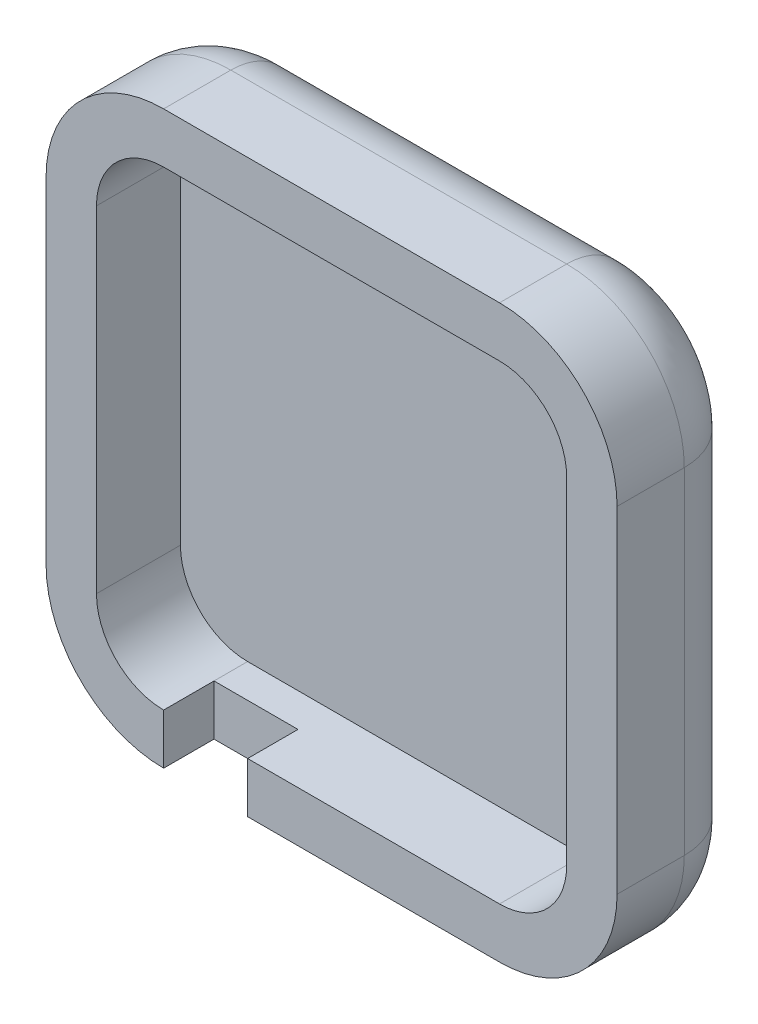
ISO-10303-21;
HEADER;
FILE_DESCRIPTION(('STEP AP214'),'2;1');
FILE_NAME('part.step','',(''),(''),'','','');
FILE_SCHEMA(('AUTOMOTIVE_DESIGN { 1 0 10303 214 1 1 1 1 }'));
ENDSEC;
DATA;
#1=APPLICATION_CONTEXT('core data for automotive mechanical design processes');
#2=APPLICATION_PROTOCOL_DEFINITION('international standard','automotive_design',2000,#1);
#3=PRODUCT_CONTEXT('',#1,'mechanical');
#4=PRODUCT('Part','Part','',(#3));
#5=PRODUCT_RELATED_PRODUCT_CATEGORY('part','',(#4));
#6=PRODUCT_DEFINITION_FORMATION('','',#4);
#7=PRODUCT_DEFINITION_CONTEXT('part definition',#1,'design');
#8=PRODUCT_DEFINITION('design','',#6,#7);
#9=PRODUCT_DEFINITION_SHAPE('','',#8);
#10=(LENGTH_UNIT() NAMED_UNIT(*) SI_UNIT(.MILLI.,.METRE.));
#11=(NAMED_UNIT(*) PLANE_ANGLE_UNIT() SI_UNIT($,.RADIAN.));
#12=(NAMED_UNIT(*) SI_UNIT($,.STERADIAN.) SOLID_ANGLE_UNIT());
#13=UNCERTAINTY_MEASURE_WITH_UNIT(LENGTH_MEASURE(1.E-05),#10,'distance_accuracy_value','');
#14=(GEOMETRIC_REPRESENTATION_CONTEXT(3) GLOBAL_UNCERTAINTY_ASSIGNED_CONTEXT((#13)) GLOBAL_UNIT_ASSIGNED_CONTEXT((#10,
#11,#12)) REPRESENTATION_CONTEXT('',''));
#15=CARTESIAN_POINT('',(0.,0.,0.));
#16=DIRECTION('',(0.,0.,1.));
#17=DIRECTION('',(1.,0.,0.));
#18=AXIS2_PLACEMENT_3D('',#15,#16,#17);
#19=CARTESIAN_POINT('',(0.,0.,4.));
#20=DIRECTION('',(1.,0.,0.));
#21=DIRECTION('',(0.,0.,-1.));
#22=AXIS2_PLACEMENT_3D('',#19,#20,#21);
#23=PLANE('',#22);
#24=DIRECTION('',(0.,0.,-1.));
#25=VECTOR('',#24,1.);
#26=CARTESIAN_POINT('',(0.,13.5,4.));
#27=LINE('',#26,#25);
#28=CARTESIAN_POINT('',(0.,13.5,4.));
#29=VERTEX_POINT('',#28);
#30=CARTESIAN_POINT('',(0.,13.5,2.));
#31=VERTEX_POINT('',#30);
#32=EDGE_CURVE('E242',#29,#31,#27,.T.);
#33=ORIENTED_EDGE('',*,*,#32,.T.);
#34=DIRECTION('',(0.,-1.,0.));
#35=VECTOR('',#34,1.);
#36=CARTESIAN_POINT('',(0.,3.5,2.));
#37=LINE('',#36,#35);
#38=CARTESIAN_POINT('',(0.,3.5,2.));
#39=VERTEX_POINT('',#38);
#40=EDGE_CURVE('E274',#31,#39,#37,.T.);
#41=ORIENTED_EDGE('',*,*,#40,.T.);
#42=DIRECTION('',(0.,0.,-1.));
#43=VECTOR('',#42,1.);
#44=CARTESIAN_POINT('',(0.,3.5,4.));
#45=LINE('',#44,#43);
#46=CARTESIAN_POINT('',(0.,3.5,4.));
#47=VERTEX_POINT('',#46);
#48=EDGE_CURVE('E245',#39,#47,#45,.F.);
#49=ORIENTED_EDGE('',*,*,#48,.T.);
#50=DIRECTION('',(0.,-1.,0.));
#51=VECTOR('',#50,1.);
#52=CARTESIAN_POINT('',(0.,0.,4.));
#53=LINE('',#52,#51);
#54=EDGE_CURVE('E332',#29,#47,#53,.T.);
#55=ORIENTED_EDGE('',*,*,#54,.F.);
#56=EDGE_LOOP('',(#33,#41,#49,#55));
#57=FACE_BOUND('',#56,.T.);
#58=ADVANCED_FACE('F35',(#57),#23,.F.);
#59=CARTESIAN_POINT('',(0.,0.,4.));
#60=DIRECTION('',(0.,1.,0.));
#61=DIRECTION('',(0.,0.,1.));
#62=AXIS2_PLACEMENT_3D('',#59,#60,#61);
#63=PLANE('',#62);
#64=DIRECTION('',(0.,0.,-1.));
#65=VECTOR('',#64,1.);
#66=CARTESIAN_POINT('',(3.5,0.,4.));
#67=LINE('',#66,#65);
#68=CARTESIAN_POINT('',(3.50000000000002,0.,2.5));
#69=VERTEX_POINT('',#68);
#70=CARTESIAN_POINT('',(3.5,0.,2.));
#71=VERTEX_POINT('',#70);
#72=EDGE_CURVE('E202',#69,#71,#67,.T.);
#73=ORIENTED_EDGE('',*,*,#72,.T.);
#74=DIRECTION('',(1.,0.,0.));
#75=VECTOR('',#74,1.);
#76=CARTESIAN_POINT('',(13.5,0.,2.));
#77=LINE('',#76,#75);
#78=CARTESIAN_POINT('',(13.5,0.,2.));
#79=VERTEX_POINT('',#78);
#80=EDGE_CURVE('E271',#71,#79,#77,.T.);
#81=ORIENTED_EDGE('',*,*,#80,.T.);
#82=DIRECTION('',(0.,0.,-1.));
#83=VECTOR('',#82,1.);
#84=CARTESIAN_POINT('',(13.5,0.,4.));
#85=LINE('',#84,#83);
#86=CARTESIAN_POINT('',(13.5,0.,4.));
#87=VERTEX_POINT('',#86);
#88=EDGE_CURVE('E201',#79,#87,#85,.F.);
#89=ORIENTED_EDGE('',*,*,#88,.T.);
#90=DIRECTION('',(1.,0.,0.));
#91=VECTOR('',#90,1.);
#92=CARTESIAN_POINT('',(0.,0.,4.));
#93=LINE('',#92,#91);
#94=CARTESIAN_POINT('',(6.,0.,4.));
#95=VERTEX_POINT('',#94);
#96=EDGE_CURVE('E344',#95,#87,#93,.T.);
#97=ORIENTED_EDGE('',*,*,#96,.F.);
#98=DIRECTION('',(0.,0.,1.));
#99=VECTOR('',#98,1.);
#100=CARTESIAN_POINT('',(6.,0.,2.5));
#101=LINE('',#100,#99);
#102=CARTESIAN_POINT('',(6.,0.,2.5));
#103=VERTEX_POINT('',#102);
#104=EDGE_CURVE('E221',#103,#95,#101,.T.);
#105=ORIENTED_EDGE('',*,*,#104,.F.);
#106=DIRECTION('',(1.,0.,0.));
#107=VECTOR('',#106,1.);
#108=CARTESIAN_POINT('',(3.50000000000002,0.,2.5));
#109=LINE('',#108,#107);
#110=EDGE_CURVE('E209',#69,#103,#109,.T.);
#111=ORIENTED_EDGE('',*,*,#110,.F.);
#112=EDGE_LOOP('',(#73,#81,#89,#97,#105,#111));
#113=FACE_BOUND('',#112,.T.);
#114=ADVANCED_FACE('F218',(#113),#63,.F.);
#115=CARTESIAN_POINT('',(17.,0.,4.));
#116=DIRECTION('',(-1.,0.,0.));
#117=DIRECTION('',(0.,0.,1.));
#118=AXIS2_PLACEMENT_3D('',#115,#116,#117);
#119=PLANE('',#118);
#120=DIRECTION('',(0.,0.,-1.));
#121=VECTOR('',#120,1.);
#122=CARTESIAN_POINT('',(17.,3.5,4.));
#123=LINE('',#122,#121);
#124=CARTESIAN_POINT('',(17.,3.5,4.));
#125=VERTEX_POINT('',#124);
#126=CARTESIAN_POINT('',(17.,3.5,2.));
#127=VERTEX_POINT('',#126);
#128=EDGE_CURVE('E228',#125,#127,#123,.T.);
#129=ORIENTED_EDGE('',*,*,#128,.T.);
#130=DIRECTION('',(0.,1.,0.));
#131=VECTOR('',#130,1.);
#132=CARTESIAN_POINT('',(17.,13.5,2.));
#133=LINE('',#132,#131);
#134=CARTESIAN_POINT('',(17.,13.5,2.));
#135=VERTEX_POINT('',#134);
#136=EDGE_CURVE('E11',#127,#135,#133,.T.);
#137=ORIENTED_EDGE('',*,*,#136,.T.);
#138=DIRECTION('',(0.,0.,-1.));
#139=VECTOR('',#138,1.);
#140=CARTESIAN_POINT('',(17.,13.5,4.));
#141=LINE('',#140,#139);
#142=CARTESIAN_POINT('',(17.,13.5,4.));
#143=VERTEX_POINT('',#142);
#144=EDGE_CURVE('E229',#135,#143,#141,.F.);
#145=ORIENTED_EDGE('',*,*,#144,.T.);
#146=DIRECTION('',(0.,1.,0.));
#147=VECTOR('',#146,1.);
#148=CARTESIAN_POINT('',(17.,0.,4.));
#149=LINE('',#148,#147);
#150=EDGE_CURVE('E347',#125,#143,#149,.T.);
#151=ORIENTED_EDGE('',*,*,#150,.F.);
#152=EDGE_LOOP('',(#129,#137,#145,#151));
#153=FACE_BOUND('',#152,.T.);
#154=ADVANCED_FACE('F390',(#153),#119,.F.);
#155=CARTESIAN_POINT('',(0.,17.,4.));
#156=DIRECTION('',(0.,-1.,0.));
#157=DIRECTION('',(0.,0.,-1.));
#158=AXIS2_PLACEMENT_3D('',#155,#156,#157);
#159=PLANE('',#158);
#160=DIRECTION('',(0.,0.,-1.));
#161=VECTOR('',#160,1.);
#162=CARTESIAN_POINT('',(13.5,17.,4.));
#163=LINE('',#162,#161);
#164=CARTESIAN_POINT('',(13.5,17.,4.));
#165=VERTEX_POINT('',#164);
#166=CARTESIAN_POINT('',(13.5,17.,2.));
#167=VERTEX_POINT('',#166);
#168=EDGE_CURVE('E249',#165,#167,#163,.T.);
#169=ORIENTED_EDGE('',*,*,#168,.T.);
#170=DIRECTION('',(-1.,0.,0.));
#171=VECTOR('',#170,1.);
#172=CARTESIAN_POINT('',(3.5,17.,2.));
#173=LINE('',#172,#171);
#174=CARTESIAN_POINT('',(3.5,17.,2.));
#175=VERTEX_POINT('',#174);
#176=EDGE_CURVE('E278',#167,#175,#173,.T.);
#177=ORIENTED_EDGE('',*,*,#176,.T.);
#178=DIRECTION('',(0.,0.,-1.));
#179=VECTOR('',#178,1.);
#180=CARTESIAN_POINT('',(3.5,17.,4.));
#181=LINE('',#180,#179);
#182=CARTESIAN_POINT('',(3.5,17.,4.));
#183=VERTEX_POINT('',#182);
#184=EDGE_CURVE('E247',#175,#183,#181,.F.);
#185=ORIENTED_EDGE('',*,*,#184,.T.);
#186=DIRECTION('',(-1.,0.,0.));
#187=VECTOR('',#186,1.);
#188=CARTESIAN_POINT('',(0.,17.,4.));
#189=LINE('',#188,#187);
#190=EDGE_CURVE('E350',#165,#183,#189,.T.);
#191=ORIENTED_EDGE('',*,*,#190,.F.);
#192=EDGE_LOOP('',(#169,#177,#185,#191));
#193=FACE_BOUND('',#192,.T.);
#194=ADVANCED_FACE('F399',(#193),#159,.F.);
#195=CARTESIAN_POINT('',(0.,0.,4.));
#196=DIRECTION('',(0.,0.,-1.));
#197=DIRECTION('',(-1.,0.,0.));
#198=AXIS2_PLACEMENT_3D('',#195,#196,#197);
#199=PLANE('',#198);
#200=CARTESIAN_POINT('',(3.5,3.5,4.));
#201=DIRECTION('',(0.,0.,-1.));
#202=DIRECTION('',(-1.,0.,0.));
#203=AXIS2_PLACEMENT_3D('',#200,#201,#202);
#204=CIRCLE('',#203,3.5);
#205=CARTESIAN_POINT('',(3.5,0.,4.));
#206=VERTEX_POINT('',#205);
#207=EDGE_CURVE('E238',#47,#206,#204,.F.);
#208=ORIENTED_EDGE('',*,*,#207,.T.);
#209=DIRECTION('',(0.,-1.,0.));
#210=VECTOR('',#209,1.);
#211=CARTESIAN_POINT('',(3.50000000000002,1.5,4.));
#212=LINE('',#211,#210);
#213=CARTESIAN_POINT('',(3.50000000000002,1.5,4.));
#214=VERTEX_POINT('',#213);
#215=EDGE_CURVE('E196',#214,#206,#212,.T.);
#216=ORIENTED_EDGE('',*,*,#215,.F.);
#217=CARTESIAN_POINT('',(3.5,3.5,4.));
#218=DIRECTION('',(0.,0.,-1.));
#219=DIRECTION('',(-1.,0.,0.));
#220=AXIS2_PLACEMENT_3D('',#217,#218,#219);
#221=CIRCLE('',#220,2.);
#222=CARTESIAN_POINT('',(1.5,3.5,4.));
#223=VERTEX_POINT('',#222);
#224=EDGE_CURVE('E386',#214,#223,#221,.T.);
#225=ORIENTED_EDGE('',*,*,#224,.T.);
#226=DIRECTION('',(0.,-1.,0.));
#227=VECTOR('',#226,1.);
#228=CARTESIAN_POINT('',(1.5,15.5,4.));
#229=LINE('',#228,#227);
#230=CARTESIAN_POINT('',(1.5,13.5,4.));
#231=VERTEX_POINT('',#230);
#232=EDGE_CURVE('E314',#231,#223,#229,.T.);
#233=ORIENTED_EDGE('',*,*,#232,.F.);
#234=CARTESIAN_POINT('',(3.5,13.5,4.));
#235=DIRECTION('',(0.,0.,-1.));
#236=DIRECTION('',(-1.,0.,0.));
#237=AXIS2_PLACEMENT_3D('',#234,#235,#236);
#238=CIRCLE('',#237,2.);
#239=CARTESIAN_POINT('',(3.5,15.5,4.));
#240=VERTEX_POINT('',#239);
#241=EDGE_CURVE('E384',#231,#240,#238,.T.);
#242=ORIENTED_EDGE('',*,*,#241,.T.);
#243=DIRECTION('',(-1.,0.,0.));
#244=VECTOR('',#243,1.);
#245=CARTESIAN_POINT('',(1.5,15.5,4.));
#246=LINE('',#245,#244);
#247=CARTESIAN_POINT('',(13.5,15.5,4.));
#248=VERTEX_POINT('',#247);
#249=EDGE_CURVE('E323',#248,#240,#246,.T.);
#250=ORIENTED_EDGE('',*,*,#249,.F.);
#251=CARTESIAN_POINT('',(13.5,13.5,4.));
#252=DIRECTION('',(0.,0.,-1.));
#253=DIRECTION('',(-1.,0.,0.));
#254=AXIS2_PLACEMENT_3D('',#251,#252,#253);
#255=CIRCLE('',#254,2.);
#256=CARTESIAN_POINT('',(15.5,13.5,4.));
#257=VERTEX_POINT('',#256);
#258=EDGE_CURVE('E388',#248,#257,#255,.T.);
#259=ORIENTED_EDGE('',*,*,#258,.T.);
#260=DIRECTION('',(0.,1.,0.));
#261=VECTOR('',#260,1.);
#262=CARTESIAN_POINT('',(15.5,15.5,4.));
#263=LINE('',#262,#261);
#264=CARTESIAN_POINT('',(15.5,3.5,4.));
#265=VERTEX_POINT('',#264);
#266=EDGE_CURVE('E337',#265,#257,#263,.T.);
#267=ORIENTED_EDGE('',*,*,#266,.F.);
#268=CARTESIAN_POINT('',(13.5,3.5,4.));
#269=DIRECTION('',(0.,0.,-1.));
#270=DIRECTION('',(-1.,0.,0.));
#271=AXIS2_PLACEMENT_3D('',#268,#269,#270);
#272=CIRCLE('',#271,2.);
#273=CARTESIAN_POINT('',(13.5,1.5,4.));
#274=VERTEX_POINT('',#273);
#275=EDGE_CURVE('E381',#265,#274,#272,.T.);
#276=ORIENTED_EDGE('',*,*,#275,.T.);
#277=DIRECTION('',(1.,0.,0.));
#278=VECTOR('',#277,1.);
#279=CARTESIAN_POINT('',(1.5,1.5,4.));
#280=LINE('',#279,#278);
#281=CARTESIAN_POINT('',(6.,1.5,4.));
#282=VERTEX_POINT('',#281);
#283=EDGE_CURVE('E335',#282,#274,#280,.T.);
#284=ORIENTED_EDGE('',*,*,#283,.F.);
#285=DIRECTION('',(0.,1.,0.));
#286=VECTOR('',#285,1.);
#287=CARTESIAN_POINT('',(6.,1.5,4.));
#288=LINE('',#287,#286);
#289=EDGE_CURVE('E214',#95,#282,#288,.T.);
#290=ORIENTED_EDGE('',*,*,#289,.F.);
#291=ORIENTED_EDGE('',*,*,#96,.T.);
#292=CARTESIAN_POINT('',(13.5,3.5,4.));
#293=DIRECTION('',(0.,0.,-1.));
#294=DIRECTION('',(-1.,0.,0.));
#295=AXIS2_PLACEMENT_3D('',#292,#293,#294);
#296=CIRCLE('',#295,3.5);
#297=EDGE_CURVE('E240',#87,#125,#296,.F.);
#298=ORIENTED_EDGE('',*,*,#297,.T.);
#299=ORIENTED_EDGE('',*,*,#150,.T.);
#300=CARTESIAN_POINT('',(13.5,13.5,4.));
#301=DIRECTION('',(0.,0.,-1.));
#302=DIRECTION('',(-1.,0.,0.));
#303=AXIS2_PLACEMENT_3D('',#300,#301,#302);
#304=CIRCLE('',#303,3.5);
#305=EDGE_CURVE('E236',#143,#165,#304,.F.);
#306=ORIENTED_EDGE('',*,*,#305,.T.);
#307=ORIENTED_EDGE('',*,*,#190,.T.);
#308=CARTESIAN_POINT('',(3.5,13.5,4.));
#309=DIRECTION('',(0.,0.,-1.));
#310=DIRECTION('',(-1.,0.,0.));
#311=AXIS2_PLACEMENT_3D('',#308,#309,#310);
#312=CIRCLE('',#311,3.5);
#313=EDGE_CURVE('E234',#183,#29,#312,.F.);
#314=ORIENTED_EDGE('',*,*,#313,.T.);
#315=ORIENTED_EDGE('',*,*,#54,.T.);
#316=EDGE_LOOP('',(#208,#216,#225,#233,#242,#250,#259,#267,#276,#284,#290,#291,#298,#299,#306,
#307,#314,#315));
#317=FACE_BOUND('',#316,.T.);
#318=ADVANCED_FACE('F394',(#317),#199,.F.);
#319=CARTESIAN_POINT('',(0.,0.,0.));
#320=DIRECTION('',(0.,0.,-1.));
#321=DIRECTION('',(-1.,0.,0.));
#322=AXIS2_PLACEMENT_3D('',#319,#320,#321);
#323=PLANE('',#322);
#324=DIRECTION('',(0.,1.,0.));
#325=VECTOR('',#324,1.);
#326=CARTESIAN_POINT('',(15.,3.5,0.));
#327=LINE('',#326,#325);
#328=CARTESIAN_POINT('',(15.,13.5,0.));
#329=VERTEX_POINT('',#328);
#330=CARTESIAN_POINT('',(15.,3.5,0.));
#331=VERTEX_POINT('',#330);
#332=EDGE_CURVE('E251',#329,#331,#327,.F.);
#333=ORIENTED_EDGE('',*,*,#332,.T.);
#334=CARTESIAN_POINT('',(13.5,3.5,0.));
#335=DIRECTION('',(0.,0.,-1.));
#336=DIRECTION('',(-1.,0.,0.));
#337=AXIS2_PLACEMENT_3D('',#334,#335,#336);
#338=CIRCLE('',#337,1.5);
#339=CARTESIAN_POINT('',(13.5,2.,0.));
#340=VERTEX_POINT('',#339);
#341=EDGE_CURVE('E265',#331,#340,#338,.T.);
#342=ORIENTED_EDGE('',*,*,#341,.T.);
#343=DIRECTION('',(1.,0.,0.));
#344=VECTOR('',#343,1.);
#345=CARTESIAN_POINT('',(3.5,2.,0.));
#346=LINE('',#345,#344);
#347=CARTESIAN_POINT('',(3.5,2.,0.));
#348=VERTEX_POINT('',#347);
#349=EDGE_CURVE('E263',#340,#348,#346,.F.);
#350=ORIENTED_EDGE('',*,*,#349,.T.);
#351=CARTESIAN_POINT('',(3.5,3.5,0.));
#352=DIRECTION('',(0.,0.,-1.));
#353=DIRECTION('',(-1.,0.,0.));
#354=AXIS2_PLACEMENT_3D('',#351,#352,#353);
#355=CIRCLE('',#354,1.5);
#356=CARTESIAN_POINT('',(2.,3.5,0.));
#357=VERTEX_POINT('',#356);
#358=EDGE_CURVE('E261',#348,#357,#355,.T.);
#359=ORIENTED_EDGE('',*,*,#358,.T.);
#360=DIRECTION('',(0.,-1.,0.));
#361=VECTOR('',#360,1.);
#362=CARTESIAN_POINT('',(2.,13.5,0.));
#363=LINE('',#362,#361);
#364=CARTESIAN_POINT('',(2.,13.5,0.));
#365=VERTEX_POINT('',#364);
#366=EDGE_CURVE('E259',#357,#365,#363,.F.);
#367=ORIENTED_EDGE('',*,*,#366,.T.);
#368=CARTESIAN_POINT('',(3.5,13.5,0.));
#369=DIRECTION('',(0.,0.,-1.));
#370=DIRECTION('',(-1.,0.,0.));
#371=AXIS2_PLACEMENT_3D('',#368,#369,#370);
#372=CIRCLE('',#371,1.5);
#373=CARTESIAN_POINT('',(3.5,15.,0.));
#374=VERTEX_POINT('',#373);
#375=EDGE_CURVE('E257',#365,#374,#372,.T.);
#376=ORIENTED_EDGE('',*,*,#375,.T.);
#377=DIRECTION('',(-1.,0.,0.));
#378=VECTOR('',#377,1.);
#379=CARTESIAN_POINT('',(13.5,15.,0.));
#380=LINE('',#379,#378);
#381=CARTESIAN_POINT('',(13.5,15.,0.));
#382=VERTEX_POINT('',#381);
#383=EDGE_CURVE('E255',#374,#382,#380,.F.);
#384=ORIENTED_EDGE('',*,*,#383,.T.);
#385=CARTESIAN_POINT('',(13.5,13.5,0.));
#386=DIRECTION('',(0.,0.,-1.));
#387=DIRECTION('',(-1.,0.,0.));
#388=AXIS2_PLACEMENT_3D('',#385,#386,#387);
#389=CIRCLE('',#388,1.5);
#390=EDGE_CURVE('E253',#382,#329,#389,.T.);
#391=ORIENTED_EDGE('',*,*,#390,.T.);
#392=EDGE_LOOP('',(#333,#342,#350,#359,#367,#376,#384,#391));
#393=FACE_BOUND('',#392,.T.);
#394=ADVANCED_FACE('F409',(#393),#323,.T.);
#395=CARTESIAN_POINT('',(1.5,15.5,1.5));
#396=DIRECTION('',(-1.,0.,0.));
#397=DIRECTION('',(0.,-1.,0.));
#398=AXIS2_PLACEMENT_3D('',#395,#396,#397);
#399=PLANE('',#398);
#400=DIRECTION('',(0.,-1.,0.));
#401=VECTOR('',#400,1.);
#402=CARTESIAN_POINT('',(1.5,15.5,1.5));
#403=LINE('',#402,#401);
#404=CARTESIAN_POINT('',(1.5,13.5,1.5));
#405=VERTEX_POINT('',#404);
#406=CARTESIAN_POINT('',(1.5,3.5,1.5));
#407=VERTEX_POINT('',#406);
#408=EDGE_CURVE('E319',#405,#407,#403,.T.);
#409=ORIENTED_EDGE('',*,*,#408,.F.);
#410=DIRECTION('',(0.,0.,1.));
#411=VECTOR('',#410,1.);
#412=CARTESIAN_POINT('',(1.5,13.5,4.));
#413=LINE('',#412,#411);
#414=EDGE_CURVE('E373',#405,#231,#413,.T.);
#415=ORIENTED_EDGE('',*,*,#414,.T.);
#416=ORIENTED_EDGE('',*,*,#232,.T.);
#417=DIRECTION('',(0.,0.,1.));
#418=VECTOR('',#417,1.);
#419=CARTESIAN_POINT('',(1.5,3.5,1.5));
#420=LINE('',#419,#418);
#421=EDGE_CURVE('E371',#223,#407,#420,.F.);
#422=ORIENTED_EDGE('',*,*,#421,.T.);
#423=EDGE_LOOP('',(#409,#415,#416,#422));
#424=FACE_BOUND('',#423,.T.);
#425=ADVANCED_FACE('F568',(#424),#399,.F.);
#426=CARTESIAN_POINT('',(1.5,15.5,1.5));
#427=DIRECTION('',(0.,1.,0.));
#428=DIRECTION('',(0.,0.,1.));
#429=AXIS2_PLACEMENT_3D('',#426,#427,#428);
#430=PLANE('',#429);
#431=ORIENTED_EDGE('',*,*,#249,.T.);
#432=DIRECTION('',(0.,0.,1.));
#433=VECTOR('',#432,1.);
#434=CARTESIAN_POINT('',(3.5,15.5,1.5));
#435=LINE('',#434,#433);
#436=CARTESIAN_POINT('',(3.5,15.5,1.5));
#437=VERTEX_POINT('',#436);
#438=EDGE_CURVE('E379',#240,#437,#435,.F.);
#439=ORIENTED_EDGE('',*,*,#438,.T.);
#440=DIRECTION('',(-1.,0.,0.));
#441=VECTOR('',#440,1.);
#442=CARTESIAN_POINT('',(1.5,15.5,1.5));
#443=LINE('',#442,#441);
#444=CARTESIAN_POINT('',(13.5,15.5,1.5));
#445=VERTEX_POINT('',#444);
#446=EDGE_CURVE('E329',#445,#437,#443,.T.);
#447=ORIENTED_EDGE('',*,*,#446,.F.);
#448=DIRECTION('',(0.,0.,1.));
#449=VECTOR('',#448,1.);
#450=CARTESIAN_POINT('',(13.5,15.5,4.));
#451=LINE('',#450,#449);
#452=EDGE_CURVE('E376',#445,#248,#451,.T.);
#453=ORIENTED_EDGE('',*,*,#452,.T.);
#454=EDGE_LOOP('',(#431,#439,#447,#453));
#455=FACE_BOUND('',#454,.T.);
#456=ADVANCED_FACE('F677',(#455),#430,.F.);
#457=CARTESIAN_POINT('',(15.5,15.5,1.5));
#458=DIRECTION('',(1.,0.,0.));
#459=DIRECTION('',(0.,1.,0.));
#460=AXIS2_PLACEMENT_3D('',#457,#458,#459);
#461=PLANE('',#460);
#462=DIRECTION('',(0.,1.,0.));
#463=VECTOR('',#462,1.);
#464=CARTESIAN_POINT('',(15.5,15.5,1.5));
#465=LINE('',#464,#463);
#466=CARTESIAN_POINT('',(15.5,3.5,1.5));
#467=VERTEX_POINT('',#466);
#468=CARTESIAN_POINT('',(15.5,13.5,1.5));
#469=VERTEX_POINT('',#468);
#470=EDGE_CURVE('E326',#467,#469,#465,.T.);
#471=ORIENTED_EDGE('',*,*,#470,.F.);
#472=DIRECTION('',(0.,0.,1.));
#473=VECTOR('',#472,1.);
#474=CARTESIAN_POINT('',(15.5,3.5,4.));
#475=LINE('',#474,#473);
#476=EDGE_CURVE('E355',#467,#265,#475,.T.);
#477=ORIENTED_EDGE('',*,*,#476,.T.);
#478=ORIENTED_EDGE('',*,*,#266,.T.);
#479=DIRECTION('',(0.,0.,1.));
#480=VECTOR('',#479,1.);
#481=CARTESIAN_POINT('',(15.5,13.5,1.5));
#482=LINE('',#481,#480);
#483=EDGE_CURVE('E353',#257,#469,#482,.F.);
#484=ORIENTED_EDGE('',*,*,#483,.T.);
#485=EDGE_LOOP('',(#471,#477,#478,#484));
#486=FACE_BOUND('',#485,.T.);
#487=ADVANCED_FACE('F636',(#486),#461,.F.);
#488=CARTESIAN_POINT('',(1.5,1.5,1.5));
#489=DIRECTION('',(0.,-1.,0.));
#490=DIRECTION('',(0.,0.,-1.));
#491=AXIS2_PLACEMENT_3D('',#488,#489,#490);
#492=PLANE('',#491);
#493=DIRECTION('',(-1.,0.,0.));
#494=VECTOR('',#493,1.);
#495=CARTESIAN_POINT('',(3.50000000000002,1.5,2.5));
#496=LINE('',#495,#494);
#497=CARTESIAN_POINT('',(6.,1.5,2.5));
#498=VERTEX_POINT('',#497);
#499=CARTESIAN_POINT('',(3.50000000000002,1.5,2.5));
#500=VERTEX_POINT('',#499);
#501=EDGE_CURVE('E212',#498,#500,#496,.T.);
#502=ORIENTED_EDGE('',*,*,#501,.F.);
#503=DIRECTION('',(0.,0.,1.));
#504=VECTOR('',#503,1.);
#505=CARTESIAN_POINT('',(6.,1.5,2.5));
#506=LINE('',#505,#504);
#507=EDGE_CURVE('E315',#498,#282,#506,.T.);
#508=ORIENTED_EDGE('',*,*,#507,.T.);
#509=ORIENTED_EDGE('',*,*,#283,.T.);
#510=DIRECTION('',(0.,0.,1.));
#511=VECTOR('',#510,1.);
#512=CARTESIAN_POINT('',(13.5,1.5,1.5));
#513=LINE('',#512,#511);
#514=CARTESIAN_POINT('',(13.5,1.5,1.5));
#515=VERTEX_POINT('',#514);
#516=EDGE_CURVE('E361',#274,#515,#513,.F.);
#517=ORIENTED_EDGE('',*,*,#516,.T.);
#518=DIRECTION('',(1.,0.,0.));
#519=VECTOR('',#518,1.);
#520=CARTESIAN_POINT('',(1.5,1.5,1.5));
#521=LINE('',#520,#519);
#522=CARTESIAN_POINT('',(3.5,1.5,1.5));
#523=VERTEX_POINT('',#522);
#524=EDGE_CURVE('E322',#523,#515,#521,.T.);
#525=ORIENTED_EDGE('',*,*,#524,.F.);
#526=DIRECTION('',(0.,0.,1.));
#527=VECTOR('',#526,1.);
#528=CARTESIAN_POINT('',(3.5,1.5,4.));
#529=LINE('',#528,#527);
#530=EDGE_CURVE('E358',#523,#500,#529,.T.);
#531=ORIENTED_EDGE('',*,*,#530,.T.);
#532=EDGE_LOOP('',(#502,#508,#509,#517,#525,#531));
#533=FACE_BOUND('',#532,.T.);
#534=ADVANCED_FACE('F631',(#533),#492,.F.);
#535=CARTESIAN_POINT('',(0.,0.,1.5));
#536=DIRECTION('',(0.,0.,1.));
#537=DIRECTION('',(1.,0.,0.));
#538=AXIS2_PLACEMENT_3D('',#535,#536,#537);
#539=PLANE('',#538);
#540=ORIENTED_EDGE('',*,*,#524,.T.);
#541=CARTESIAN_POINT('',(13.5,3.5,1.5));
#542=DIRECTION('',(0.,0.,1.));
#543=DIRECTION('',(1.,0.,0.));
#544=AXIS2_PLACEMENT_3D('',#541,#542,#543);
#545=CIRCLE('',#544,2.);
#546=EDGE_CURVE('E369',#515,#467,#545,.T.);
#547=ORIENTED_EDGE('',*,*,#546,.T.);
#548=ORIENTED_EDGE('',*,*,#470,.T.);
#549=CARTESIAN_POINT('',(13.5,13.5,1.5));
#550=DIRECTION('',(0.,0.,1.));
#551=DIRECTION('',(1.,0.,0.));
#552=AXIS2_PLACEMENT_3D('',#549,#550,#551);
#553=CIRCLE('',#552,2.);
#554=EDGE_CURVE('E363',#469,#445,#553,.T.);
#555=ORIENTED_EDGE('',*,*,#554,.T.);
#556=ORIENTED_EDGE('',*,*,#446,.T.);
#557=CARTESIAN_POINT('',(3.5,13.5,1.5));
#558=DIRECTION('',(0.,0.,1.));
#559=DIRECTION('',(1.,0.,0.));
#560=AXIS2_PLACEMENT_3D('',#557,#558,#559);
#561=CIRCLE('',#560,2.);
#562=EDGE_CURVE('E367',#437,#405,#561,.T.);
#563=ORIENTED_EDGE('',*,*,#562,.T.);
#564=ORIENTED_EDGE('',*,*,#408,.T.);
#565=CARTESIAN_POINT('',(3.5,3.5,1.5));
#566=DIRECTION('',(0.,0.,1.));
#567=DIRECTION('',(1.,0.,0.));
#568=AXIS2_PLACEMENT_3D('',#565,#566,#567);
#569=CIRCLE('',#568,2.);
#570=EDGE_CURVE('E365',#407,#523,#569,.T.);
#571=ORIENTED_EDGE('',*,*,#570,.T.);
#572=EDGE_LOOP('',(#540,#547,#548,#555,#556,#563,#564,#571));
#573=FACE_BOUND('',#572,.T.);
#574=ADVANCED_FACE('F459',(#573),#539,.T.);
#575=CARTESIAN_POINT('',(13.5,3.5,1.5));
#576=DIRECTION('',(0.,0.,-1.));
#577=DIRECTION('',(-1.,0.,0.));
#578=AXIS2_PLACEMENT_3D('',#575,#576,#577);
#579=CYLINDRICAL_SURFACE('',#578,2.);
#580=ORIENTED_EDGE('',*,*,#546,.F.);
#581=ORIENTED_EDGE('',*,*,#516,.F.);
#582=ORIENTED_EDGE('',*,*,#275,.F.);
#583=ORIENTED_EDGE('',*,*,#476,.F.);
#584=EDGE_LOOP('',(#580,#581,#582,#583));
#585=FACE_BOUND('',#584,.T.);
#586=ADVANCED_FACE('F455',(#585),#579,.F.);
#587=CARTESIAN_POINT('',(3.5,13.5,1.5));
#588=DIRECTION('',(0.,0.,-1.));
#589=DIRECTION('',(-1.,0.,0.));
#590=AXIS2_PLACEMENT_3D('',#587,#588,#589);
#591=CYLINDRICAL_SURFACE('',#590,2.);
#592=ORIENTED_EDGE('',*,*,#562,.F.);
#593=ORIENTED_EDGE('',*,*,#438,.F.);
#594=ORIENTED_EDGE('',*,*,#241,.F.);
#595=ORIENTED_EDGE('',*,*,#414,.F.);
#596=EDGE_LOOP('',(#592,#593,#594,#595));
#597=FACE_BOUND('',#596,.T.);
#598=ADVANCED_FACE('F458',(#597),#591,.F.);
#599=CARTESIAN_POINT('',(3.5,3.5,1.5));
#600=DIRECTION('',(0.,0.,-1.));
#601=DIRECTION('',(-1.,0.,0.));
#602=AXIS2_PLACEMENT_3D('',#599,#600,#601);
#603=CYLINDRICAL_SURFACE('',#602,2.);
#604=ORIENTED_EDGE('',*,*,#570,.F.);
#605=ORIENTED_EDGE('',*,*,#421,.F.);
#606=ORIENTED_EDGE('',*,*,#224,.F.);
#607=DIRECTION('',(0.,0.,1.));
#608=VECTOR('',#607,1.);
#609=CARTESIAN_POINT('',(3.50000000000002,1.5,2.5));
#610=LINE('',#609,#608);
#611=EDGE_CURVE('E312',#500,#214,#610,.T.);
#612=ORIENTED_EDGE('',*,*,#611,.F.);
#613=ORIENTED_EDGE('',*,*,#530,.F.);
#614=EDGE_LOOP('',(#604,#605,#606,#612,#613));
#615=FACE_BOUND('',#614,.T.);
#616=ADVANCED_FACE('F463',(#615),#603,.F.);
#617=CARTESIAN_POINT('',(13.5,13.5,1.5));
#618=DIRECTION('',(0.,0.,-1.));
#619=DIRECTION('',(-1.,0.,0.));
#620=AXIS2_PLACEMENT_3D('',#617,#618,#619);
#621=CYLINDRICAL_SURFACE('',#620,2.);
#622=ORIENTED_EDGE('',*,*,#554,.F.);
#623=ORIENTED_EDGE('',*,*,#483,.F.);
#624=ORIENTED_EDGE('',*,*,#258,.F.);
#625=ORIENTED_EDGE('',*,*,#452,.F.);
#626=EDGE_LOOP('',(#622,#623,#624,#625));
#627=FACE_BOUND('',#626,.T.);
#628=ADVANCED_FACE('F467',(#627),#621,.F.);
#629=CARTESIAN_POINT('',(13.5,3.5,4.));
#630=DIRECTION('',(0.,0.,-1.));
#631=DIRECTION('',(-1.,0.,0.));
#632=AXIS2_PLACEMENT_3D('',#629,#630,#631);
#633=CYLINDRICAL_SURFACE('',#632,3.5);
#634=ORIENTED_EDGE('',*,*,#88,.F.);
#635=CARTESIAN_POINT('',(13.5,3.5,2.));
#636=DIRECTION('',(0.,0.,-1.));
#637=DIRECTION('',(-1.,0.,0.));
#638=AXIS2_PLACEMENT_3D('',#635,#636,#637);
#639=CIRCLE('',#638,3.5);
#640=EDGE_CURVE('E268',#79,#127,#639,.F.);
#641=ORIENTED_EDGE('',*,*,#640,.T.);
#642=ORIENTED_EDGE('',*,*,#128,.F.);
#643=ORIENTED_EDGE('',*,*,#297,.F.);
#644=EDGE_LOOP('',(#634,#641,#642,#643));
#645=FACE_BOUND('',#644,.T.);
#646=ADVANCED_FACE('F433',(#645),#633,.T.);
#647=CARTESIAN_POINT('',(3.5,3.5,4.));
#648=DIRECTION('',(0.,0.,-1.));
#649=DIRECTION('',(-1.,0.,0.));
#650=AXIS2_PLACEMENT_3D('',#647,#648,#649);
#651=CYLINDRICAL_SURFACE('',#650,3.5);
#652=ORIENTED_EDGE('',*,*,#48,.F.);
#653=CARTESIAN_POINT('',(3.5,3.5,2.));
#654=DIRECTION('',(0.,0.,-1.));
#655=DIRECTION('',(-1.,0.,0.));
#656=AXIS2_PLACEMENT_3D('',#653,#654,#655);
#657=CIRCLE('',#656,3.5);
#658=EDGE_CURVE('E227',#39,#71,#657,.F.);
#659=ORIENTED_EDGE('',*,*,#658,.T.);
#660=ORIENTED_EDGE('',*,*,#72,.F.);
#661=EDGE_CURVE('E190',#206,#69,#67,.T.);
#662=ORIENTED_EDGE('',*,*,#661,.F.);
#663=ORIENTED_EDGE('',*,*,#207,.F.);
#664=EDGE_LOOP('',(#652,#659,#660,#662,#663));
#665=FACE_BOUND('',#664,.T.);
#666=ADVANCED_FACE('F225',(#665),#651,.T.);
#667=CARTESIAN_POINT('',(13.5,13.5,4.));
#668=DIRECTION('',(0.,0.,-1.));
#669=DIRECTION('',(-1.,0.,0.));
#670=AXIS2_PLACEMENT_3D('',#667,#668,#669);
#671=CYLINDRICAL_SURFACE('',#670,3.5);
#672=ORIENTED_EDGE('',*,*,#144,.F.);
#673=CARTESIAN_POINT('',(13.5,13.5,2.));
#674=DIRECTION('',(0.,0.,-1.));
#675=DIRECTION('',(-1.,0.,0.));
#676=AXIS2_PLACEMENT_3D('',#673,#674,#675);
#677=CIRCLE('',#676,3.5);
#678=EDGE_CURVE('E44',#135,#167,#677,.F.);
#679=ORIENTED_EDGE('',*,*,#678,.T.);
#680=ORIENTED_EDGE('',*,*,#168,.F.);
#681=ORIENTED_EDGE('',*,*,#305,.F.);
#682=EDGE_LOOP('',(#672,#679,#680,#681));
#683=FACE_BOUND('',#682,.T.);
#684=ADVANCED_FACE('F397',(#683),#671,.T.);
#685=CARTESIAN_POINT('',(3.5,13.5,4.));
#686=DIRECTION('',(0.,0.,-1.));
#687=DIRECTION('',(-1.,0.,0.));
#688=AXIS2_PLACEMENT_3D('',#685,#686,#687);
#689=CYLINDRICAL_SURFACE('',#688,3.5);
#690=ORIENTED_EDGE('',*,*,#184,.F.);
#691=CARTESIAN_POINT('',(3.5,13.5,2.));
#692=DIRECTION('',(0.,0.,-1.));
#693=DIRECTION('',(-1.,0.,0.));
#694=AXIS2_PLACEMENT_3D('',#691,#692,#693);
#695=CIRCLE('',#694,3.5);
#696=EDGE_CURVE('E276',#175,#31,#695,.F.);
#697=ORIENTED_EDGE('',*,*,#696,.T.);
#698=ORIENTED_EDGE('',*,*,#32,.F.);
#699=ORIENTED_EDGE('',*,*,#313,.F.);
#700=EDGE_LOOP('',(#690,#697,#698,#699));
#701=FACE_BOUND('',#700,.T.);
#702=ADVANCED_FACE('F416',(#701),#689,.T.);
#703=CARTESIAN_POINT('',(3.50000000000002,1.5,2.5));
#704=DIRECTION('',(-1.,0.,0.));
#705=DIRECTION('',(0.,0.,1.));
#706=AXIS2_PLACEMENT_3D('',#703,#704,#705);
#707=PLANE('',#706);
#708=ORIENTED_EDGE('',*,*,#215,.T.);
#709=ORIENTED_EDGE('',*,*,#661,.T.);
#710=DIRECTION('',(0.,-1.,0.));
#711=VECTOR('',#710,1.);
#712=CARTESIAN_POINT('',(3.50000000000002,1.5,2.5));
#713=LINE('',#712,#711);
#714=EDGE_CURVE('E193',#500,#69,#713,.T.);
#715=ORIENTED_EDGE('',*,*,#714,.F.);
#716=ORIENTED_EDGE('',*,*,#611,.T.);
#717=EDGE_LOOP('',(#708,#709,#715,#716));
#718=FACE_BOUND('',#717,.T.);
#719=ADVANCED_FACE('F192',(#718),#707,.F.);
#720=CARTESIAN_POINT('',(6.,1.5,2.5));
#721=DIRECTION('',(1.,0.,0.));
#722=DIRECTION('',(0.,0.,-1.));
#723=AXIS2_PLACEMENT_3D('',#720,#721,#722);
#724=PLANE('',#723);
#725=ORIENTED_EDGE('',*,*,#289,.T.);
#726=ORIENTED_EDGE('',*,*,#507,.F.);
#727=DIRECTION('',(0.,1.,0.));
#728=VECTOR('',#727,1.);
#729=CARTESIAN_POINT('',(6.,1.5,2.5));
#730=LINE('',#729,#728);
#731=EDGE_CURVE('E222',#103,#498,#730,.T.);
#732=ORIENTED_EDGE('',*,*,#731,.F.);
#733=ORIENTED_EDGE('',*,*,#104,.T.);
#734=EDGE_LOOP('',(#725,#726,#732,#733));
#735=FACE_BOUND('',#734,.T.);
#736=ADVANCED_FACE('F604',(#735),#724,.F.);
#737=CARTESIAN_POINT('',(0.,0.,2.5));
#738=DIRECTION('',(0.,0.,1.));
#739=DIRECTION('',(1.,0.,0.));
#740=AXIS2_PLACEMENT_3D('',#737,#738,#739);
#741=PLANE('',#740);
#742=ORIENTED_EDGE('',*,*,#714,.T.);
#743=ORIENTED_EDGE('',*,*,#110,.T.);
#744=ORIENTED_EDGE('',*,*,#731,.T.);
#745=ORIENTED_EDGE('',*,*,#501,.T.);
#746=EDGE_LOOP('',(#742,#743,#744,#745));
#747=FACE_BOUND('',#746,.T.);
#748=ADVANCED_FACE('F207',(#747),#741,.T.);
#749=CARTESIAN_POINT('',(3.5,13.5,2.));
#750=DIRECTION('',(0.,0.,-1.));
#751=DIRECTION('',(-1.,0.,0.));
#752=AXIS2_PLACEMENT_3D('',#749,#750,#751);
#753=DEGENERATE_TOROIDAL_SURFACE('',#752,1.5,2.,.T.);
#754=CARTESIAN_POINT('',(2.,13.5,2.));
#755=DIRECTION('',(0.,-1.,0.));
#756=DIRECTION('',(0.,0.,-1.));
#757=AXIS2_PLACEMENT_3D('',#754,#755,#756);
#758=CIRCLE('',#757,2.);
#759=EDGE_CURVE('E296',#31,#365,#758,.T.);
#760=ORIENTED_EDGE('',*,*,#759,.F.);
#761=ORIENTED_EDGE('',*,*,#696,.F.);
#762=CARTESIAN_POINT('',(3.5,15.,2.));
#763=DIRECTION('',(1.,0.,0.));
#764=DIRECTION('',(0.,0.,-1.));
#765=AXIS2_PLACEMENT_3D('',#762,#763,#764);
#766=CIRCLE('',#765,2.);
#767=EDGE_CURVE('E39',#374,#175,#766,.T.);
#768=ORIENTED_EDGE('',*,*,#767,.F.);
#769=ORIENTED_EDGE('',*,*,#375,.F.);
#770=EDGE_LOOP('',(#760,#761,#768,#769));
#771=FACE_BOUND('',#770,.T.);
#772=ADVANCED_FACE('F37',(#771),#753,.T.);
#773=CARTESIAN_POINT('',(0.,15.,2.));
#774=DIRECTION('',(1.,0.,0.));
#775=DIRECTION('',(0.,0.,-1.));
#776=AXIS2_PLACEMENT_3D('',#773,#774,#775);
#777=CYLINDRICAL_SURFACE('',#776,2.);
#778=ORIENTED_EDGE('',*,*,#767,.T.);
#779=ORIENTED_EDGE('',*,*,#176,.F.);
#780=CARTESIAN_POINT('',(13.5,15.,2.));
#781=DIRECTION('',(1.,0.,0.));
#782=DIRECTION('',(0.,0.,-1.));
#783=AXIS2_PLACEMENT_3D('',#780,#781,#782);
#784=CIRCLE('',#783,2.);
#785=EDGE_CURVE('E294',#382,#167,#784,.T.);
#786=ORIENTED_EDGE('',*,*,#785,.F.);
#787=ORIENTED_EDGE('',*,*,#383,.F.);
#788=EDGE_LOOP('',(#778,#779,#786,#787));
#789=FACE_BOUND('',#788,.T.);
#790=ADVANCED_FACE('F402',(#789),#777,.T.);
#791=CARTESIAN_POINT('',(2.,0.,2.));
#792=DIRECTION('',(0.,1.,0.));
#793=DIRECTION('',(0.,0.,1.));
#794=AXIS2_PLACEMENT_3D('',#791,#792,#793);
#795=CYLINDRICAL_SURFACE('',#794,2.);
#796=ORIENTED_EDGE('',*,*,#759,.T.);
#797=ORIENTED_EDGE('',*,*,#366,.F.);
#798=CARTESIAN_POINT('',(2.,3.5,2.));
#799=DIRECTION('',(0.,-1.,0.));
#800=DIRECTION('',(0.,0.,-1.));
#801=AXIS2_PLACEMENT_3D('',#798,#799,#800);
#802=CIRCLE('',#801,2.);
#803=EDGE_CURVE('E291',#39,#357,#802,.T.);
#804=ORIENTED_EDGE('',*,*,#803,.F.);
#805=ORIENTED_EDGE('',*,*,#40,.F.);
#806=EDGE_LOOP('',(#796,#797,#804,#805));
#807=FACE_BOUND('',#806,.T.);
#808=ADVANCED_FACE('F421',(#807),#795,.T.);
#809=CARTESIAN_POINT('',(13.5,13.5,2.));
#810=DIRECTION('',(0.,0.,-1.));
#811=DIRECTION('',(-1.,0.,0.));
#812=AXIS2_PLACEMENT_3D('',#809,#810,#811);
#813=DEGENERATE_TOROIDAL_SURFACE('',#812,1.5,2.,.T.);
#814=ORIENTED_EDGE('',*,*,#785,.T.);
#815=ORIENTED_EDGE('',*,*,#678,.F.);
#816=CARTESIAN_POINT('',(15.,13.5,2.));
#817=DIRECTION('',(0.,-1.,0.));
#818=DIRECTION('',(0.,0.,-1.));
#819=AXIS2_PLACEMENT_3D('',#816,#817,#818);
#820=CIRCLE('',#819,2.);
#821=EDGE_CURVE('E288',#329,#135,#820,.T.);
#822=ORIENTED_EDGE('',*,*,#821,.F.);
#823=ORIENTED_EDGE('',*,*,#390,.F.);
#824=EDGE_LOOP('',(#814,#815,#822,#823));
#825=FACE_BOUND('',#824,.T.);
#826=ADVANCED_FACE('F405',(#825),#813,.T.);
#827=CARTESIAN_POINT('',(3.5,3.5,2.));
#828=DIRECTION('',(0.,0.,-1.));
#829=DIRECTION('',(-1.,0.,0.));
#830=AXIS2_PLACEMENT_3D('',#827,#828,#829);
#831=DEGENERATE_TOROIDAL_SURFACE('',#830,1.5,2.,.T.);
#832=ORIENTED_EDGE('',*,*,#803,.T.);
#833=ORIENTED_EDGE('',*,*,#358,.F.);
#834=CARTESIAN_POINT('',(3.5,2.,2.));
#835=DIRECTION('',(1.,0.,0.));
#836=DIRECTION('',(0.,0.,-1.));
#837=AXIS2_PLACEMENT_3D('',#834,#835,#836);
#838=CIRCLE('',#837,2.);
#839=EDGE_CURVE('E285',#71,#348,#838,.T.);
#840=ORIENTED_EDGE('',*,*,#839,.F.);
#841=ORIENTED_EDGE('',*,*,#658,.F.);
#842=EDGE_LOOP('',(#832,#833,#840,#841));
#843=FACE_BOUND('',#842,.T.);
#844=ADVANCED_FACE('F424',(#843),#831,.T.);
#845=CARTESIAN_POINT('',(15.,0.,2.));
#846=DIRECTION('',(0.,-1.,0.));
#847=DIRECTION('',(0.,0.,-1.));
#848=AXIS2_PLACEMENT_3D('',#845,#846,#847);
#849=CYLINDRICAL_SURFACE('',#848,2.);
#850=ORIENTED_EDGE('',*,*,#821,.T.);
#851=ORIENTED_EDGE('',*,*,#136,.F.);
#852=CARTESIAN_POINT('',(15.,3.5,2.));
#853=DIRECTION('',(0.,-1.,0.));
#854=DIRECTION('',(0.,0.,-1.));
#855=AXIS2_PLACEMENT_3D('',#852,#853,#854);
#856=CIRCLE('',#855,2.);
#857=EDGE_CURVE('E283',#331,#127,#856,.T.);
#858=ORIENTED_EDGE('',*,*,#857,.F.);
#859=ORIENTED_EDGE('',*,*,#332,.F.);
#860=EDGE_LOOP('',(#850,#851,#858,#859));
#861=FACE_BOUND('',#860,.T.);
#862=ADVANCED_FACE('F438',(#861),#849,.T.);
#863=CARTESIAN_POINT('',(0.,2.,2.));
#864=DIRECTION('',(-1.,0.,0.));
#865=DIRECTION('',(0.,0.,1.));
#866=AXIS2_PLACEMENT_3D('',#863,#864,#865);
#867=CYLINDRICAL_SURFACE('',#866,2.);
#868=ORIENTED_EDGE('',*,*,#839,.T.);
#869=ORIENTED_EDGE('',*,*,#349,.F.);
#870=CARTESIAN_POINT('',(13.5,2.,2.));
#871=DIRECTION('',(1.,0.,0.));
#872=DIRECTION('',(0.,0.,-1.));
#873=AXIS2_PLACEMENT_3D('',#870,#871,#872);
#874=CIRCLE('',#873,2.);
#875=EDGE_CURVE('E281',#79,#340,#874,.T.);
#876=ORIENTED_EDGE('',*,*,#875,.F.);
#877=ORIENTED_EDGE('',*,*,#80,.F.);
#878=EDGE_LOOP('',(#868,#869,#876,#877));
#879=FACE_BOUND('',#878,.T.);
#880=ADVANCED_FACE('F429',(#879),#867,.T.);
#881=CARTESIAN_POINT('',(13.5,3.5,2.));
#882=DIRECTION('',(0.,0.,-1.));
#883=DIRECTION('',(-1.,0.,0.));
#884=AXIS2_PLACEMENT_3D('',#881,#882,#883);
#885=DEGENERATE_TOROIDAL_SURFACE('',#884,1.5,2.,.T.);
#886=ORIENTED_EDGE('',*,*,#857,.T.);
#887=ORIENTED_EDGE('',*,*,#640,.F.);
#888=ORIENTED_EDGE('',*,*,#875,.T.);
#889=ORIENTED_EDGE('',*,*,#341,.F.);
#890=EDGE_LOOP('',(#886,#887,#888,#889));
#891=FACE_BOUND('',#890,.T.);
#892=ADVANCED_FACE('F435',(#891),#885,.T.);
#893=CLOSED_SHELL('',(#58,#114,#154,#194,#318,#394,#425,#456,#487,#534,#574,#586,#598,#616,#628,
#646,#666,#684,#702,#719,#736,#748,#772,#790,#808,#826,#844,#862,#880,#892));
#894=MANIFOLD_SOLID_BREP('B2',#893);
#895=ADVANCED_BREP_SHAPE_REPRESENTATION('',(#18,#894),#14);
#896=SHAPE_DEFINITION_REPRESENTATION(#9,#895);
ENDSEC;
END-ISO-10303-21;
